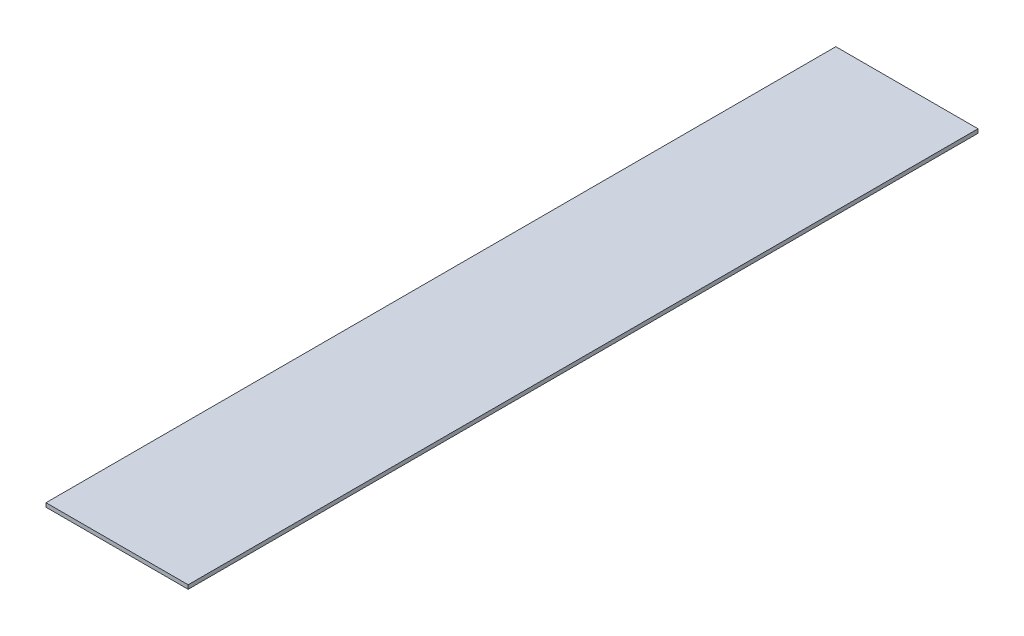
ISO-10303-21;
HEADER;
FILE_DESCRIPTION(('STEP AP214'),'2;1');
FILE_NAME('part.step','',(''),(''),'','','');
FILE_SCHEMA(('AUTOMOTIVE_DESIGN { 1 0 10303 214 1 1 1 1 }'));
ENDSEC;
DATA;
#1=APPLICATION_CONTEXT('core data for automotive mechanical design processes');
#2=APPLICATION_PROTOCOL_DEFINITION('international standard','automotive_design',2000,#1);
#3=PRODUCT_CONTEXT('',#1,'mechanical');
#4=PRODUCT('Part','Part','',(#3));
#5=PRODUCT_RELATED_PRODUCT_CATEGORY('part','',(#4));
#6=PRODUCT_DEFINITION_FORMATION('','',#4);
#7=PRODUCT_DEFINITION_CONTEXT('part definition',#1,'design');
#8=PRODUCT_DEFINITION('design','',#6,#7);
#9=PRODUCT_DEFINITION_SHAPE('','',#8);
#10=(LENGTH_UNIT() NAMED_UNIT(*) SI_UNIT(.MILLI.,.METRE.));
#11=(NAMED_UNIT(*) PLANE_ANGLE_UNIT() SI_UNIT($,.RADIAN.));
#12=(NAMED_UNIT(*) SI_UNIT($,.STERADIAN.) SOLID_ANGLE_UNIT());
#13=UNCERTAINTY_MEASURE_WITH_UNIT(LENGTH_MEASURE(1.E-05),#10,'distance_accuracy_value','');
#14=(GEOMETRIC_REPRESENTATION_CONTEXT(3) GLOBAL_UNCERTAINTY_ASSIGNED_CONTEXT((#13)) GLOBAL_UNIT_ASSIGNED_CONTEXT((#10,
#11,#12)) REPRESENTATION_CONTEXT('',''));
#15=CARTESIAN_POINT('',(0.,0.,0.));
#16=DIRECTION('',(0.,0.,1.));
#17=DIRECTION('',(1.,0.,0.));
#18=AXIS2_PLACEMENT_3D('',#15,#16,#17);
#19=CARTESIAN_POINT('',(54.,3.,-300.));
#20=DIRECTION('',(-1.,0.,0.));
#21=DIRECTION('',(0.,0.,1.));
#22=AXIS2_PLACEMENT_3D('',#19,#20,#21);
#23=PLANE('',#22);
#24=DIRECTION('',(0.,0.,-1.));
#25=VECTOR('',#24,1.);
#26=CARTESIAN_POINT('',(54.,0.,-300.));
#27=LINE('',#26,#25);
#28=CARTESIAN_POINT('',(54.,0.,300.));
#29=VERTEX_POINT('',#28);
#30=CARTESIAN_POINT('',(54.,0.,-300.));
#31=VERTEX_POINT('',#30);
#32=EDGE_CURVE('E96',#29,#31,#27,.T.);
#33=ORIENTED_EDGE('',*,*,#32,.T.);
#34=DIRECTION('',(0.,-1.,0.));
#35=VECTOR('',#34,1.);
#36=CARTESIAN_POINT('',(54.,3.,-300.));
#37=LINE('',#36,#35);
#38=CARTESIAN_POINT('',(54.,3.,-300.));
#39=VERTEX_POINT('',#38);
#40=EDGE_CURVE('E11',#39,#31,#37,.T.);
#41=ORIENTED_EDGE('',*,*,#40,.F.);
#42=DIRECTION('',(0.,0.,-1.));
#43=VECTOR('',#42,1.);
#44=CARTESIAN_POINT('',(54.,3.,-300.));
#45=LINE('',#44,#43);
#46=CARTESIAN_POINT('',(54.,3.,300.));
#47=VERTEX_POINT('',#46);
#48=EDGE_CURVE('E84',#47,#39,#45,.T.);
#49=ORIENTED_EDGE('',*,*,#48,.F.);
#50=DIRECTION('',(0.,-1.,0.));
#51=VECTOR('',#50,1.);
#52=CARTESIAN_POINT('',(54.,3.,300.));
#53=LINE('',#52,#51);
#54=EDGE_CURVE('E92',#47,#29,#53,.T.);
#55=ORIENTED_EDGE('',*,*,#54,.T.);
#56=EDGE_LOOP('',(#33,#41,#49,#55));
#57=FACE_BOUND('',#56,.T.);
#58=ADVANCED_FACE('F33',(#57),#23,.F.);
#59=CARTESIAN_POINT('',(-54.,3.,-300.));
#60=DIRECTION('',(0.,0.,1.));
#61=DIRECTION('',(1.,0.,0.));
#62=AXIS2_PLACEMENT_3D('',#59,#60,#61);
#63=PLANE('',#62);
#64=DIRECTION('',(-1.,0.,0.));
#65=VECTOR('',#64,1.);
#66=CARTESIAN_POINT('',(-54.,0.,-300.));
#67=LINE('',#66,#65);
#68=CARTESIAN_POINT('',(-54.,0.,-300.));
#69=VERTEX_POINT('',#68);
#70=EDGE_CURVE('E88',#31,#69,#67,.T.);
#71=ORIENTED_EDGE('',*,*,#70,.T.);
#72=DIRECTION('',(0.,-1.,0.));
#73=VECTOR('',#72,1.);
#74=CARTESIAN_POINT('',(-54.,3.,-300.));
#75=LINE('',#74,#73);
#76=CARTESIAN_POINT('',(-54.,3.,-300.));
#77=VERTEX_POINT('',#76);
#78=EDGE_CURVE('E41',#77,#69,#75,.T.);
#79=ORIENTED_EDGE('',*,*,#78,.F.);
#80=DIRECTION('',(-1.,0.,0.));
#81=VECTOR('',#80,1.);
#82=CARTESIAN_POINT('',(-54.,3.,-300.));
#83=LINE('',#82,#81);
#84=EDGE_CURVE('E79',#39,#77,#83,.T.);
#85=ORIENTED_EDGE('',*,*,#84,.F.);
#86=ORIENTED_EDGE('',*,*,#40,.T.);
#87=EDGE_LOOP('',(#71,#79,#85,#86));
#88=FACE_BOUND('',#87,.T.);
#89=ADVANCED_FACE('F87',(#88),#63,.F.);
#90=CARTESIAN_POINT('',(-54.,3.,-300.));
#91=DIRECTION('',(1.,0.,0.));
#92=DIRECTION('',(0.,0.,-1.));
#93=AXIS2_PLACEMENT_3D('',#90,#91,#92);
#94=PLANE('',#93);
#95=DIRECTION('',(0.,0.,1.));
#96=VECTOR('',#95,1.);
#97=CARTESIAN_POINT('',(-54.,0.,-300.));
#98=LINE('',#97,#96);
#99=CARTESIAN_POINT('',(-54.,0.,300.));
#100=VERTEX_POINT('',#99);
#101=EDGE_CURVE('E66',#69,#100,#98,.T.);
#102=ORIENTED_EDGE('',*,*,#101,.T.);
#103=DIRECTION('',(0.,-1.,0.));
#104=VECTOR('',#103,1.);
#105=CARTESIAN_POINT('',(-54.,3.,300.));
#106=LINE('',#105,#104);
#107=CARTESIAN_POINT('',(-54.,3.,300.));
#108=VERTEX_POINT('',#107);
#109=EDGE_CURVE('E89',#108,#100,#106,.T.);
#110=ORIENTED_EDGE('',*,*,#109,.F.);
#111=DIRECTION('',(0.,0.,1.));
#112=VECTOR('',#111,1.);
#113=CARTESIAN_POINT('',(-54.,3.,-300.));
#114=LINE('',#113,#112);
#115=EDGE_CURVE('E82',#77,#108,#114,.T.);
#116=ORIENTED_EDGE('',*,*,#115,.F.);
#117=ORIENTED_EDGE('',*,*,#78,.T.);
#118=EDGE_LOOP('',(#102,#110,#116,#117));
#119=FACE_BOUND('',#118,.T.);
#120=ADVANCED_FACE('F90',(#119),#94,.F.);
#121=CARTESIAN_POINT('',(-54.,3.,300.));
#122=DIRECTION('',(0.,0.,-1.));
#123=DIRECTION('',(-1.,0.,0.));
#124=AXIS2_PLACEMENT_3D('',#121,#122,#123);
#125=PLANE('',#124);
#126=DIRECTION('',(1.,0.,0.));
#127=VECTOR('',#126,1.);
#128=CARTESIAN_POINT('',(-54.,0.,300.));
#129=LINE('',#128,#127);
#130=EDGE_CURVE('E72',#100,#29,#129,.T.);
#131=ORIENTED_EDGE('',*,*,#130,.T.);
#132=ORIENTED_EDGE('',*,*,#54,.F.);
#133=DIRECTION('',(1.,0.,0.));
#134=VECTOR('',#133,1.);
#135=CARTESIAN_POINT('',(-54.,3.,300.));
#136=LINE('',#135,#134);
#137=EDGE_CURVE('E49',#108,#47,#136,.T.);
#138=ORIENTED_EDGE('',*,*,#137,.F.);
#139=ORIENTED_EDGE('',*,*,#109,.T.);
#140=EDGE_LOOP('',(#131,#132,#138,#139));
#141=FACE_BOUND('',#140,.T.);
#142=ADVANCED_FACE('F103',(#141),#125,.F.);
#143=CARTESIAN_POINT('',(0.,3.,0.));
#144=DIRECTION('',(0.,1.,0.));
#145=DIRECTION('',(0.,0.,1.));
#146=AXIS2_PLACEMENT_3D('',#143,#144,#145);
#147=PLANE('',#146);
#148=ORIENTED_EDGE('',*,*,#48,.T.);
#149=ORIENTED_EDGE('',*,*,#84,.T.);
#150=ORIENTED_EDGE('',*,*,#115,.T.);
#151=ORIENTED_EDGE('',*,*,#137,.T.);
#152=EDGE_LOOP('',(#148,#149,#150,#151));
#153=FACE_BOUND('',#152,.T.);
#154=ADVANCED_FACE('F80',(#153),#147,.T.);
#155=CARTESIAN_POINT('',(0.,0.,0.));
#156=DIRECTION('',(0.,1.,0.));
#157=DIRECTION('',(0.,0.,1.));
#158=AXIS2_PLACEMENT_3D('',#155,#156,#157);
#159=PLANE('',#158);
#160=ORIENTED_EDGE('',*,*,#32,.F.);
#161=ORIENTED_EDGE('',*,*,#130,.F.);
#162=ORIENTED_EDGE('',*,*,#101,.F.);
#163=ORIENTED_EDGE('',*,*,#70,.F.);
#164=EDGE_LOOP('',(#160,#161,#162,#163));
#165=FACE_BOUND('',#164,.T.);
#166=ADVANCED_FACE('F106',(#165),#159,.F.);
#167=CLOSED_SHELL('',(#58,#89,#120,#142,#154,#166));
#168=MANIFOLD_SOLID_BREP('B2',#167);
#169=ADVANCED_BREP_SHAPE_REPRESENTATION('',(#18,#168),#14);
#170=SHAPE_DEFINITION_REPRESENTATION(#9,#169);
ENDSEC;
END-ISO-10303-21;
